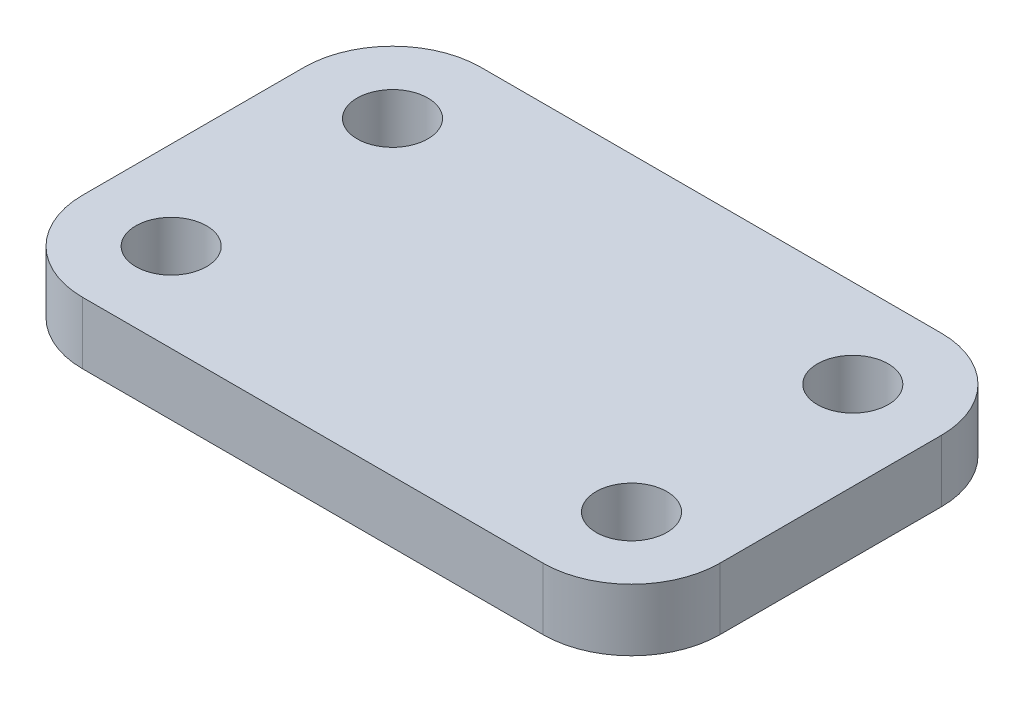
ISO-10303-21;
HEADER;
FILE_DESCRIPTION(('STEP AP214'),'2;1');
FILE_NAME('part.step','',(''),(''),'','','');
FILE_SCHEMA(('AUTOMOTIVE_DESIGN { 1 0 10303 214 1 1 1 1 }'));
ENDSEC;
DATA;
#1=APPLICATION_CONTEXT('core data for automotive mechanical design processes');
#2=APPLICATION_PROTOCOL_DEFINITION('international standard','automotive_design',2000,#1);
#3=PRODUCT_CONTEXT('',#1,'mechanical');
#4=PRODUCT('Part','Part','',(#3));
#5=PRODUCT_RELATED_PRODUCT_CATEGORY('part','',(#4));
#6=PRODUCT_DEFINITION_FORMATION('','',#4);
#7=PRODUCT_DEFINITION_CONTEXT('part definition',#1,'design');
#8=PRODUCT_DEFINITION('design','',#6,#7);
#9=PRODUCT_DEFINITION_SHAPE('','',#8);
#10=(LENGTH_UNIT() NAMED_UNIT(*) SI_UNIT(.MILLI.,.METRE.));
#11=(NAMED_UNIT(*) PLANE_ANGLE_UNIT() SI_UNIT($,.RADIAN.));
#12=(NAMED_UNIT(*) SI_UNIT($,.STERADIAN.) SOLID_ANGLE_UNIT());
#13=UNCERTAINTY_MEASURE_WITH_UNIT(LENGTH_MEASURE(1.E-05),#10,'distance_accuracy_value','');
#14=(GEOMETRIC_REPRESENTATION_CONTEXT(3) GLOBAL_UNCERTAINTY_ASSIGNED_CONTEXT((#13)) GLOBAL_UNIT_ASSIGNED_CONTEXT((#10,
#11,#12)) REPRESENTATION_CONTEXT('',''));
#15=CARTESIAN_POINT('',(0.,0.,0.));
#16=DIRECTION('',(0.,0.,1.));
#17=DIRECTION('',(1.,0.,0.));
#18=AXIS2_PLACEMENT_3D('',#15,#16,#17);
#19=CARTESIAN_POINT('',(-35.065868263473,7.,-21.7634206210084));
#20=DIRECTION('',(0.,1.,0.));
#21=DIRECTION('',(0.,0.,1.));
#22=AXIS2_PLACEMENT_3D('',#19,#20,#21);
#23=PLANE('',#22);
#24=CARTESIAN_POINT('',(16.9341317365269,7.,3.23657937899156));
#25=DIRECTION('',(0.,1.,0.));
#26=DIRECTION('',(0.,0.,1.));
#27=AXIS2_PLACEMENT_3D('',#24,#25,#26);
#28=CIRCLE('',#27,4.);
#29=CARTESIAN_POINT('',(16.9341317365269,7.,7.23657937899156));
#30=VERTEX_POINT('',#29);
#31=EDGE_CURVE('E298',#30,#30,#28,.T.);
#32=ORIENTED_EDGE('',*,*,#31,.F.);
#33=EDGE_LOOP('',(#32));
#34=FACE_BOUND('',#33,.T.);
#35=CARTESIAN_POINT('',(-35.065868263473,7.,-21.7634206210084));
#36=DIRECTION('',(0.,1.,0.));
#37=DIRECTION('',(0.,0.,1.));
#38=AXIS2_PLACEMENT_3D('',#35,#36,#37);
#39=CIRCLE('',#38,4.);
#40=CARTESIAN_POINT('',(-35.065868263473,7.,-17.7634206210084));
#41=VERTEX_POINT('',#40);
#42=EDGE_CURVE('E241',#41,#41,#39,.T.);
#43=ORIENTED_EDGE('',*,*,#42,.F.);
#44=EDGE_LOOP('',(#43));
#45=FACE_BOUND('',#44,.T.);
#46=CARTESIAN_POINT('',(-35.065868263473,7.,-21.7634206210084));
#47=DIRECTION('',(0.,1.,0.));
#48=DIRECTION('',(0.,0.,1.));
#49=AXIS2_PLACEMENT_3D('',#46,#47,#48);
#50=CIRCLE('',#49,10.);
#51=CARTESIAN_POINT('',(-35.065868263473,7.,-31.7634206210084));
#52=VERTEX_POINT('',#51);
#53=CARTESIAN_POINT('',(-45.065868263473,7.,-21.7634206210084));
#54=VERTEX_POINT('',#53);
#55=EDGE_CURVE('E256',#52,#54,#50,.T.);
#56=ORIENTED_EDGE('',*,*,#55,.T.);
#57=DIRECTION('',(0.,0.,1.));
#58=VECTOR('',#57,1.);
#59=CARTESIAN_POINT('',(-45.065868263473,7.,-21.7634206210084));
#60=LINE('',#59,#58);
#61=CARTESIAN_POINT('',(-45.065868263473,7.,3.23657937899156));
#62=VERTEX_POINT('',#61);
#63=EDGE_CURVE('E196',#54,#62,#60,.T.);
#64=ORIENTED_EDGE('',*,*,#63,.T.);
#65=CARTESIAN_POINT('',(-35.065868263473,7.,3.23657937899156));
#66=DIRECTION('',(0.,1.,0.));
#67=DIRECTION('',(0.,0.,1.));
#68=AXIS2_PLACEMENT_3D('',#65,#66,#67);
#69=CIRCLE('',#68,10.);
#70=CARTESIAN_POINT('',(-35.065868263473,7.,13.2365793789916));
#71=VERTEX_POINT('',#70);
#72=EDGE_CURVE('E271',#62,#71,#69,.T.);
#73=ORIENTED_EDGE('',*,*,#72,.T.);
#74=DIRECTION('',(1.,0.,0.));
#75=VECTOR('',#74,1.);
#76=CARTESIAN_POINT('',(-35.065868263473,7.,13.2365793789916));
#77=LINE('',#76,#75);
#78=CARTESIAN_POINT('',(16.9341317365269,7.,13.2365793789916));
#79=VERTEX_POINT('',#78);
#80=EDGE_CURVE('E283',#71,#79,#77,.T.);
#81=ORIENTED_EDGE('',*,*,#80,.T.);
#82=CARTESIAN_POINT('',(16.9341317365269,7.,3.23657937899156));
#83=DIRECTION('',(0.,1.,0.));
#84=DIRECTION('',(0.,0.,1.));
#85=AXIS2_PLACEMENT_3D('',#82,#83,#84);
#86=CIRCLE('',#85,10.);
#87=CARTESIAN_POINT('',(26.9341317365269,7.,3.23657937899156));
#88=VERTEX_POINT('',#87);
#89=EDGE_CURVE('E229',#79,#88,#86,.T.);
#90=ORIENTED_EDGE('',*,*,#89,.T.);
#91=DIRECTION('',(0.,0.,1.));
#92=VECTOR('',#91,1.);
#93=CARTESIAN_POINT('',(26.9341317365269,7.,-21.7634206210084));
#94=LINE('',#93,#92);
#95=CARTESIAN_POINT('',(26.9341317365269,7.,-21.7634206210084));
#96=VERTEX_POINT('',#95);
#97=EDGE_CURVE('E215',#96,#88,#94,.T.);
#98=ORIENTED_EDGE('',*,*,#97,.F.);
#99=CARTESIAN_POINT('',(16.9341317365269,7.,-21.7634206210084));
#100=DIRECTION('',(0.,-1.,0.));
#101=DIRECTION('',(0.,0.,-1.));
#102=AXIS2_PLACEMENT_3D('',#99,#100,#101);
#103=CIRCLE('',#102,10.);
#104=CARTESIAN_POINT('',(16.9341317365269,7.,-31.7634206210084));
#105=VERTEX_POINT('',#104);
#106=EDGE_CURVE('E227',#105,#96,#103,.T.);
#107=ORIENTED_EDGE('',*,*,#106,.F.);
#108=DIRECTION('',(1.,0.,0.));
#109=VECTOR('',#108,1.);
#110=CARTESIAN_POINT('',(-35.065868263473,7.,-31.7634206210084));
#111=LINE('',#110,#109);
#112=EDGE_CURVE('E233',#52,#105,#111,.T.);
#113=ORIENTED_EDGE('',*,*,#112,.F.);
#114=EDGE_LOOP('',(#56,#64,#73,#81,#90,#98,#107,#113));
#115=FACE_BOUND('',#114,.T.);
#116=CARTESIAN_POINT('',(-35.065868263473,7.,3.23657937899156));
#117=DIRECTION('',(0.,1.,0.));
#118=DIRECTION('',(0.,0.,1.));
#119=AXIS2_PLACEMENT_3D('',#116,#117,#118);
#120=CIRCLE('',#119,4.);
#121=CARTESIAN_POINT('',(-35.065868263473,7.,7.23657937899156));
#122=VERTEX_POINT('',#121);
#123=EDGE_CURVE('E292',#122,#122,#120,.T.);
#124=ORIENTED_EDGE('',*,*,#123,.F.);
#125=EDGE_LOOP('',(#124));
#126=FACE_BOUND('',#125,.T.);
#127=CARTESIAN_POINT('',(16.9341317365269,7.,-21.7634206210084));
#128=DIRECTION('',(0.,1.,0.));
#129=DIRECTION('',(0.,0.,1.));
#130=AXIS2_PLACEMENT_3D('',#127,#128,#129);
#131=CIRCLE('',#130,4.);
#132=CARTESIAN_POINT('',(16.9341317365269,7.,-17.7634206210084));
#133=VERTEX_POINT('',#132);
#134=EDGE_CURVE('E304',#133,#133,#131,.T.);
#135=ORIENTED_EDGE('',*,*,#134,.F.);
#136=EDGE_LOOP('',(#135));
#137=FACE_BOUND('',#136,.T.);
#138=ADVANCED_FACE('F141',(#34,#45,#115,#126,#137),#23,.T.);
#139=CARTESIAN_POINT('',(-35.065868263473,0.,-21.7634206210084));
#140=DIRECTION('',(0.,1.,0.));
#141=DIRECTION('',(0.,0.,1.));
#142=AXIS2_PLACEMENT_3D('',#139,#140,#141);
#143=PLANE('',#142);
#144=CARTESIAN_POINT('',(-35.065868263473,0.,-21.7634206210084));
#145=DIRECTION('',(0.,1.,0.));
#146=DIRECTION('',(0.,0.,1.));
#147=AXIS2_PLACEMENT_3D('',#144,#145,#146);
#148=CIRCLE('',#147,10.);
#149=CARTESIAN_POINT('',(-35.065868263473,0.,-31.7634206210084));
#150=VERTEX_POINT('',#149);
#151=CARTESIAN_POINT('',(-45.065868263473,0.,-21.7634206210084));
#152=VERTEX_POINT('',#151);
#153=EDGE_CURVE('E238',#150,#152,#148,.T.);
#154=ORIENTED_EDGE('',*,*,#153,.F.);
#155=DIRECTION('',(1.,0.,0.));
#156=VECTOR('',#155,1.);
#157=CARTESIAN_POINT('',(-35.065868263473,0.,-31.7634206210084));
#158=LINE('',#157,#156);
#159=CARTESIAN_POINT('',(16.9341317365269,0.,-31.7634206210084));
#160=VERTEX_POINT('',#159);
#161=EDGE_CURVE('E253',#150,#160,#158,.T.);
#162=ORIENTED_EDGE('',*,*,#161,.T.);
#163=CARTESIAN_POINT('',(16.9341317365269,0.,-21.7634206210084));
#164=DIRECTION('',(0.,-1.,0.));
#165=DIRECTION('',(0.,0.,-1.));
#166=AXIS2_PLACEMENT_3D('',#163,#164,#165);
#167=CIRCLE('',#166,10.);
#168=CARTESIAN_POINT('',(26.9341317365269,0.,-21.7634206210084));
#169=VERTEX_POINT('',#168);
#170=EDGE_CURVE('E251',#160,#169,#167,.T.);
#171=ORIENTED_EDGE('',*,*,#170,.T.);
#172=DIRECTION('',(0.,0.,1.));
#173=VECTOR('',#172,1.);
#174=CARTESIAN_POINT('',(26.9341317365269,0.,-21.7634206210084));
#175=LINE('',#174,#173);
#176=CARTESIAN_POINT('',(26.9341317365269,0.,3.23657937899156));
#177=VERTEX_POINT('',#176);
#178=EDGE_CURVE('E217',#169,#177,#175,.T.);
#179=ORIENTED_EDGE('',*,*,#178,.T.);
#180=CARTESIAN_POINT('',(16.9341317365269,0.,3.23657937899156));
#181=DIRECTION('',(0.,1.,0.));
#182=DIRECTION('',(0.,0.,1.));
#183=AXIS2_PLACEMENT_3D('',#180,#181,#182);
#184=CIRCLE('',#183,10.);
#185=CARTESIAN_POINT('',(16.9341317365269,0.,13.2365793789916));
#186=VERTEX_POINT('',#185);
#187=EDGE_CURVE('E247',#186,#177,#184,.T.);
#188=ORIENTED_EDGE('',*,*,#187,.F.);
#189=DIRECTION('',(1.,0.,0.));
#190=VECTOR('',#189,1.);
#191=CARTESIAN_POINT('',(-35.065868263473,0.,13.2365793789916));
#192=LINE('',#191,#190);
#193=CARTESIAN_POINT('',(-35.065868263473,0.,13.2365793789916));
#194=VERTEX_POINT('',#193);
#195=EDGE_CURVE('E245',#194,#186,#192,.T.);
#196=ORIENTED_EDGE('',*,*,#195,.F.);
#197=CARTESIAN_POINT('',(-35.065868263473,0.,3.23657937899156));
#198=DIRECTION('',(0.,1.,0.));
#199=DIRECTION('',(0.,0.,1.));
#200=AXIS2_PLACEMENT_3D('',#197,#198,#199);
#201=CIRCLE('',#200,10.);
#202=CARTESIAN_POINT('',(-45.065868263473,0.,3.23657937899156));
#203=VERTEX_POINT('',#202);
#204=EDGE_CURVE('E243',#203,#194,#201,.T.);
#205=ORIENTED_EDGE('',*,*,#204,.F.);
#206=DIRECTION('',(0.,0.,1.));
#207=VECTOR('',#206,1.);
#208=CARTESIAN_POINT('',(-45.065868263473,0.,-21.7634206210084));
#209=LINE('',#208,#207);
#210=EDGE_CURVE('E240',#152,#203,#209,.T.);
#211=ORIENTED_EDGE('',*,*,#210,.F.);
#212=EDGE_LOOP('',(#154,#162,#171,#179,#188,#196,#205,#211));
#213=FACE_BOUND('',#212,.T.);
#214=CARTESIAN_POINT('',(-35.065868263473,0.,-21.7634206210084));
#215=DIRECTION('',(0.,1.,0.));
#216=DIRECTION('',(0.,0.,1.));
#217=AXIS2_PLACEMENT_3D('',#214,#215,#216);
#218=CIRCLE('',#217,4.);
#219=CARTESIAN_POINT('',(-35.065868263473,0.,-17.7634206210084));
#220=VERTEX_POINT('',#219);
#221=EDGE_CURVE('E289',#220,#220,#218,.T.);
#222=ORIENTED_EDGE('',*,*,#221,.T.);
#223=EDGE_LOOP('',(#222));
#224=FACE_BOUND('',#223,.T.);
#225=CARTESIAN_POINT('',(-35.065868263473,0.,3.23657937899156));
#226=DIRECTION('',(0.,1.,0.));
#227=DIRECTION('',(0.,0.,1.));
#228=AXIS2_PLACEMENT_3D('',#225,#226,#227);
#229=CIRCLE('',#228,4.);
#230=CARTESIAN_POINT('',(-35.065868263473,0.,7.23657937899156));
#231=VERTEX_POINT('',#230);
#232=EDGE_CURVE('E295',#231,#231,#229,.T.);
#233=ORIENTED_EDGE('',*,*,#232,.T.);
#234=EDGE_LOOP('',(#233));
#235=FACE_BOUND('',#234,.T.);
#236=CARTESIAN_POINT('',(16.9341317365269,0.,3.23657937899156));
#237=DIRECTION('',(0.,1.,0.));
#238=DIRECTION('',(0.,0.,1.));
#239=AXIS2_PLACEMENT_3D('',#236,#237,#238);
#240=CIRCLE('',#239,4.);
#241=CARTESIAN_POINT('',(16.9341317365269,0.,7.23657937899156));
#242=VERTEX_POINT('',#241);
#243=EDGE_CURVE('E301',#242,#242,#240,.T.);
#244=ORIENTED_EDGE('',*,*,#243,.T.);
#245=EDGE_LOOP('',(#244));
#246=FACE_BOUND('',#245,.T.);
#247=CARTESIAN_POINT('',(16.9341317365269,0.,-21.7634206210084));
#248=DIRECTION('',(0.,1.,0.));
#249=DIRECTION('',(0.,0.,1.));
#250=AXIS2_PLACEMENT_3D('',#247,#248,#249);
#251=CIRCLE('',#250,4.);
#252=CARTESIAN_POINT('',(16.9341317365269,0.,-17.7634206210084));
#253=VERTEX_POINT('',#252);
#254=EDGE_CURVE('E307',#253,#253,#251,.T.);
#255=ORIENTED_EDGE('',*,*,#254,.T.);
#256=EDGE_LOOP('',(#255));
#257=FACE_BOUND('',#256,.T.);
#258=ADVANCED_FACE('F274',(#213,#224,#235,#246,#257),#143,.F.);
#259=CARTESIAN_POINT('',(-35.065868263473,7.,-21.7634206210084));
#260=DIRECTION('',(0.,-1.,0.));
#261=DIRECTION('',(0.,0.,-1.));
#262=AXIS2_PLACEMENT_3D('',#259,#260,#261);
#263=CYLINDRICAL_SURFACE('',#262,10.);
#264=ORIENTED_EDGE('',*,*,#153,.T.);
#265=DIRECTION('',(0.,-1.,0.));
#266=VECTOR('',#265,1.);
#267=CARTESIAN_POINT('',(-45.065868263473,7.,-21.7634206210084));
#268=LINE('',#267,#266);
#269=EDGE_CURVE('E12',#54,#152,#268,.T.);
#270=ORIENTED_EDGE('',*,*,#269,.F.);
#271=ORIENTED_EDGE('',*,*,#55,.F.);
#272=DIRECTION('',(0.,-1.,0.));
#273=VECTOR('',#272,1.);
#274=CARTESIAN_POINT('',(-35.065868263473,7.,-31.7634206210084));
#275=LINE('',#274,#273);
#276=EDGE_CURVE('E158',#52,#150,#275,.T.);
#277=ORIENTED_EDGE('',*,*,#276,.T.);
#278=EDGE_LOOP('',(#264,#270,#271,#277));
#279=FACE_BOUND('',#278,.T.);
#280=ADVANCED_FACE('F143',(#279),#263,.T.);
#281=CARTESIAN_POINT('',(-45.065868263473,7.,-21.7634206210084));
#282=DIRECTION('',(1.,0.,0.));
#283=DIRECTION('',(0.,0.,-1.));
#284=AXIS2_PLACEMENT_3D('',#281,#282,#283);
#285=PLANE('',#284);
#286=ORIENTED_EDGE('',*,*,#210,.T.);
#287=DIRECTION('',(0.,-1.,0.));
#288=VECTOR('',#287,1.);
#289=CARTESIAN_POINT('',(-45.065868263473,7.,3.23657937899156));
#290=LINE('',#289,#288);
#291=EDGE_CURVE('E150',#62,#203,#290,.T.);
#292=ORIENTED_EDGE('',*,*,#291,.F.);
#293=ORIENTED_EDGE('',*,*,#63,.F.);
#294=ORIENTED_EDGE('',*,*,#269,.T.);
#295=EDGE_LOOP('',(#286,#292,#293,#294));
#296=FACE_BOUND('',#295,.T.);
#297=ADVANCED_FACE('F341',(#296),#285,.F.);
#298=CARTESIAN_POINT('',(-35.065868263473,7.,3.23657937899156));
#299=DIRECTION('',(0.,-1.,0.));
#300=DIRECTION('',(0.,0.,-1.));
#301=AXIS2_PLACEMENT_3D('',#298,#299,#300);
#302=CYLINDRICAL_SURFACE('',#301,10.);
#303=ORIENTED_EDGE('',*,*,#204,.T.);
#304=DIRECTION('',(0.,-1.,0.));
#305=VECTOR('',#304,1.);
#306=CARTESIAN_POINT('',(-35.065868263473,7.,13.2365793789916));
#307=LINE('',#306,#305);
#308=EDGE_CURVE('E263',#71,#194,#307,.T.);
#309=ORIENTED_EDGE('',*,*,#308,.F.);
#310=ORIENTED_EDGE('',*,*,#72,.F.);
#311=ORIENTED_EDGE('',*,*,#291,.T.);
#312=EDGE_LOOP('',(#303,#309,#310,#311));
#313=FACE_BOUND('',#312,.T.);
#314=ADVANCED_FACE('F269',(#313),#302,.T.);
#315=CARTESIAN_POINT('',(-35.065868263473,7.,13.2365793789916));
#316=DIRECTION('',(0.,0.,-1.));
#317=DIRECTION('',(-1.,0.,0.));
#318=AXIS2_PLACEMENT_3D('',#315,#316,#317);
#319=PLANE('',#318);
#320=ORIENTED_EDGE('',*,*,#195,.T.);
#321=DIRECTION('',(0.,-1.,0.));
#322=VECTOR('',#321,1.);
#323=CARTESIAN_POINT('',(16.9341317365269,7.,13.2365793789916));
#324=LINE('',#323,#322);
#325=EDGE_CURVE('E260',#79,#186,#324,.T.);
#326=ORIENTED_EDGE('',*,*,#325,.F.);
#327=ORIENTED_EDGE('',*,*,#80,.F.);
#328=ORIENTED_EDGE('',*,*,#308,.T.);
#329=EDGE_LOOP('',(#320,#326,#327,#328));
#330=FACE_BOUND('',#329,.T.);
#331=ADVANCED_FACE('F279',(#330),#319,.F.);
#332=CARTESIAN_POINT('',(16.9341317365269,7.,3.23657937899156));
#333=DIRECTION('',(0.,-1.,0.));
#334=DIRECTION('',(0.,0.,-1.));
#335=AXIS2_PLACEMENT_3D('',#332,#333,#334);
#336=CYLINDRICAL_SURFACE('',#335,10.);
#337=ORIENTED_EDGE('',*,*,#187,.T.);
#338=DIRECTION('',(0.,-1.,0.));
#339=VECTOR('',#338,1.);
#340=CARTESIAN_POINT('',(26.9341317365269,7.,3.23657937899156));
#341=LINE('',#340,#339);
#342=EDGE_CURVE('E221',#88,#177,#341,.T.);
#343=ORIENTED_EDGE('',*,*,#342,.F.);
#344=ORIENTED_EDGE('',*,*,#89,.F.);
#345=ORIENTED_EDGE('',*,*,#325,.T.);
#346=EDGE_LOOP('',(#337,#343,#344,#345));
#347=FACE_BOUND('',#346,.T.);
#348=ADVANCED_FACE('F282',(#347),#336,.T.);
#349=CARTESIAN_POINT('',(26.9341317365269,7.,-21.7634206210084));
#350=DIRECTION('',(1.,0.,0.));
#351=DIRECTION('',(0.,0.,-1.));
#352=AXIS2_PLACEMENT_3D('',#349,#350,#351);
#353=PLANE('',#352);
#354=ORIENTED_EDGE('',*,*,#178,.F.);
#355=DIRECTION('',(0.,-1.,0.));
#356=VECTOR('',#355,1.);
#357=CARTESIAN_POINT('',(26.9341317365269,7.,-21.7634206210084));
#358=LINE('',#357,#356);
#359=EDGE_CURVE('E212',#96,#169,#358,.T.);
#360=ORIENTED_EDGE('',*,*,#359,.F.);
#361=ORIENTED_EDGE('',*,*,#97,.T.);
#362=ORIENTED_EDGE('',*,*,#342,.T.);
#363=EDGE_LOOP('',(#354,#360,#361,#362));
#364=FACE_BOUND('',#363,.T.);
#365=ADVANCED_FACE('F214',(#364),#353,.T.);
#366=CARTESIAN_POINT('',(16.9341317365269,7.,-21.7634206210084));
#367=DIRECTION('',(0.,-1.,0.));
#368=DIRECTION('',(0.,0.,-1.));
#369=AXIS2_PLACEMENT_3D('',#366,#367,#368);
#370=CYLINDRICAL_SURFACE('',#369,10.);
#371=ORIENTED_EDGE('',*,*,#170,.F.);
#372=DIRECTION('',(0.,-1.,0.));
#373=VECTOR('',#372,1.);
#374=CARTESIAN_POINT('',(16.9341317365269,7.,-31.7634206210084));
#375=LINE('',#374,#373);
#376=EDGE_CURVE('E184',#105,#160,#375,.T.);
#377=ORIENTED_EDGE('',*,*,#376,.F.);
#378=ORIENTED_EDGE('',*,*,#106,.T.);
#379=ORIENTED_EDGE('',*,*,#359,.T.);
#380=EDGE_LOOP('',(#371,#377,#378,#379));
#381=FACE_BOUND('',#380,.T.);
#382=ADVANCED_FACE('F232',(#381),#370,.T.);
#383=CARTESIAN_POINT('',(-35.065868263473,7.,-31.7634206210084));
#384=DIRECTION('',(0.,0.,-1.));
#385=DIRECTION('',(-1.,0.,0.));
#386=AXIS2_PLACEMENT_3D('',#383,#384,#385);
#387=PLANE('',#386);
#388=ORIENTED_EDGE('',*,*,#161,.F.);
#389=ORIENTED_EDGE('',*,*,#276,.F.);
#390=ORIENTED_EDGE('',*,*,#112,.T.);
#391=ORIENTED_EDGE('',*,*,#376,.T.);
#392=EDGE_LOOP('',(#388,#389,#390,#391));
#393=FACE_BOUND('',#392,.T.);
#394=ADVANCED_FACE('F329',(#393),#387,.T.);
#395=CARTESIAN_POINT('',(-35.065868263473,7.,-21.7634206210084));
#396=DIRECTION('',(0.,-1.,0.));
#397=DIRECTION('',(0.,0.,-1.));
#398=AXIS2_PLACEMENT_3D('',#395,#396,#397);
#399=CYLINDRICAL_SURFACE('',#398,4.);
#400=ORIENTED_EDGE('',*,*,#42,.T.);
#401=EDGE_LOOP('',(#400));
#402=FACE_BOUND('',#401,.T.);
#403=ORIENTED_EDGE('',*,*,#221,.F.);
#404=EDGE_LOOP('',(#403));
#405=FACE_BOUND('',#404,.T.);
#406=ADVANCED_FACE('F326',(#402,#405),#399,.F.);
#407=CARTESIAN_POINT('',(-35.065868263473,7.,3.23657937899156));
#408=DIRECTION('',(0.,-1.,0.));
#409=DIRECTION('',(0.,0.,-1.));
#410=AXIS2_PLACEMENT_3D('',#407,#408,#409);
#411=CYLINDRICAL_SURFACE('',#410,4.);
#412=ORIENTED_EDGE('',*,*,#123,.T.);
#413=EDGE_LOOP('',(#412));
#414=FACE_BOUND('',#413,.T.);
#415=ORIENTED_EDGE('',*,*,#232,.F.);
#416=EDGE_LOOP('',(#415));
#417=FACE_BOUND('',#416,.T.);
#418=ADVANCED_FACE('F403',(#414,#417),#411,.F.);
#419=CARTESIAN_POINT('',(16.9341317365269,7.,3.23657937899156));
#420=DIRECTION('',(0.,-1.,0.));
#421=DIRECTION('',(0.,0.,-1.));
#422=AXIS2_PLACEMENT_3D('',#419,#420,#421);
#423=CYLINDRICAL_SURFACE('',#422,4.);
#424=ORIENTED_EDGE('',*,*,#31,.T.);
#425=EDGE_LOOP('',(#424));
#426=FACE_BOUND('',#425,.T.);
#427=ORIENTED_EDGE('',*,*,#243,.F.);
#428=EDGE_LOOP('',(#427));
#429=FACE_BOUND('',#428,.T.);
#430=ADVANCED_FACE('F411',(#426,#429),#423,.F.);
#431=CARTESIAN_POINT('',(16.9341317365269,7.,-21.7634206210084));
#432=DIRECTION('',(0.,-1.,0.));
#433=DIRECTION('',(0.,0.,-1.));
#434=AXIS2_PLACEMENT_3D('',#431,#432,#433);
#435=CYLINDRICAL_SURFACE('',#434,4.);
#436=ORIENTED_EDGE('',*,*,#134,.T.);
#437=EDGE_LOOP('',(#436));
#438=FACE_BOUND('',#437,.T.);
#439=ORIENTED_EDGE('',*,*,#254,.F.);
#440=EDGE_LOOP('',(#439));
#441=FACE_BOUND('',#440,.T.);
#442=ADVANCED_FACE('F313',(#438,#441),#435,.F.);
#443=CLOSED_SHELL('',(#138,#258,#280,#297,#314,#331,#348,#365,#382,#394,#406,#418,#430,#442));
#444=MANIFOLD_SOLID_BREP('B2',#443);
#445=ADVANCED_BREP_SHAPE_REPRESENTATION('',(#18,#444),#14);
#446=SHAPE_DEFINITION_REPRESENTATION(#9,#445);
ENDSEC;
END-ISO-10303-21;
